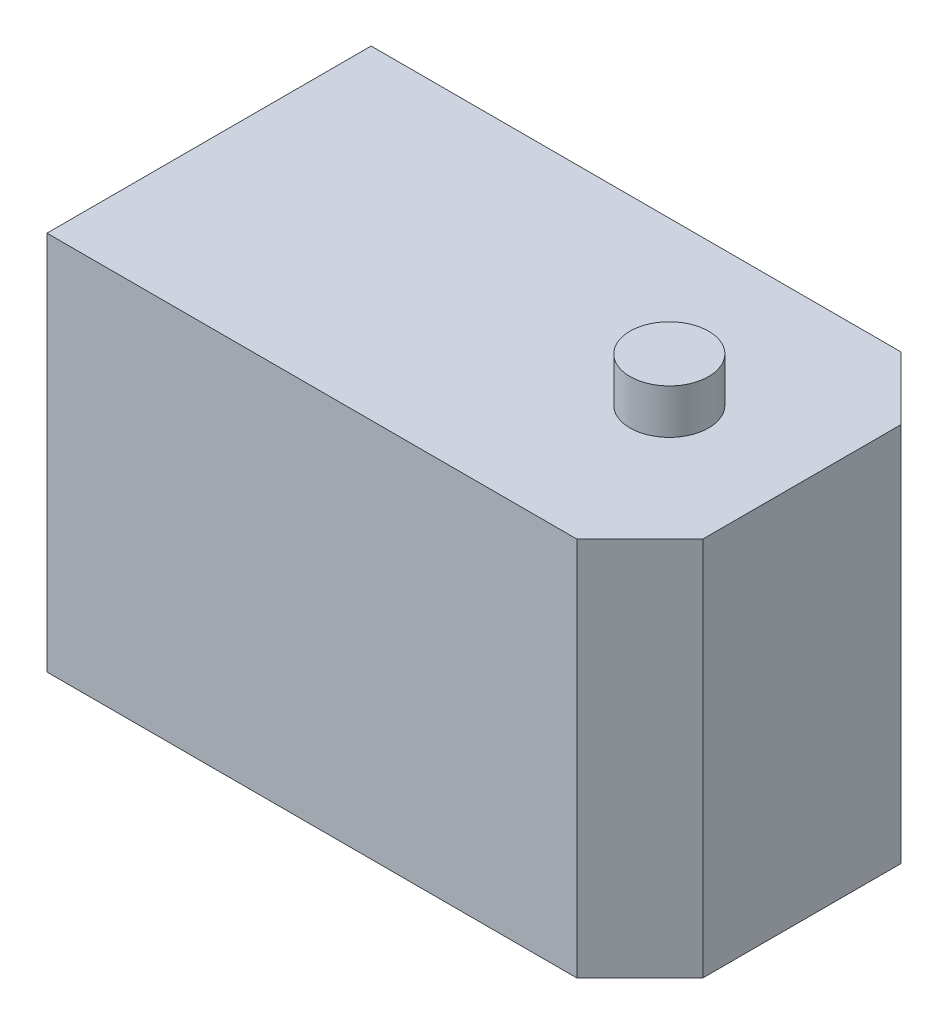
ISO-10303-21;
HEADER;
FILE_DESCRIPTION(('STEP AP214'),'2;1');
FILE_NAME('part.step','',(''),(''),'','','');
FILE_SCHEMA(('AUTOMOTIVE_DESIGN { 1 0 10303 214 1 1 1 1 }'));
ENDSEC;
DATA;
#1=APPLICATION_CONTEXT('core data for automotive mechanical design processes');
#2=APPLICATION_PROTOCOL_DEFINITION('international standard','automotive_design',2000,#1);
#3=PRODUCT_CONTEXT('',#1,'mechanical');
#4=PRODUCT('Part','Part','',(#3));
#5=PRODUCT_RELATED_PRODUCT_CATEGORY('part','',(#4));
#6=PRODUCT_DEFINITION_FORMATION('','',#4);
#7=PRODUCT_DEFINITION_CONTEXT('part definition',#1,'design');
#8=PRODUCT_DEFINITION('design','',#6,#7);
#9=PRODUCT_DEFINITION_SHAPE('','',#8);
#10=(LENGTH_UNIT() NAMED_UNIT(*) SI_UNIT(.MILLI.,.METRE.));
#11=(NAMED_UNIT(*) PLANE_ANGLE_UNIT() SI_UNIT($,.RADIAN.));
#12=(NAMED_UNIT(*) SI_UNIT($,.STERADIAN.) SOLID_ANGLE_UNIT());
#13=UNCERTAINTY_MEASURE_WITH_UNIT(LENGTH_MEASURE(1.E-05),#10,'distance_accuracy_value','');
#14=(GEOMETRIC_REPRESENTATION_CONTEXT(3) GLOBAL_UNCERTAINTY_ASSIGNED_CONTEXT((#13)) GLOBAL_UNIT_ASSIGNED_CONTEXT((#10,
#11,#12)) REPRESENTATION_CONTEXT('',''));
#15=CARTESIAN_POINT('',(0.,0.,0.));
#16=DIRECTION('',(0.,0.,1.));
#17=DIRECTION('',(1.,0.,0.));
#18=AXIS2_PLACEMENT_3D('',#15,#16,#17);
#19=CARTESIAN_POINT('',(10.115,29.,12.365));
#20=DIRECTION('',(-1.,0.,0.));
#21=DIRECTION('',(0.,0.,1.));
#22=AXIS2_PLACEMENT_3D('',#19,#20,#21);
#23=PLANE('',#22);
#24=DIRECTION('',(0.,0.,-1.));
#25=VECTOR('',#24,1.);
#26=CARTESIAN_POINT('',(10.115,0.,12.365));
#27=LINE('',#26,#25);
#28=CARTESIAN_POINT('',(10.115,0.,7.56266952966369));
#29=VERTEX_POINT('',#28);
#30=CARTESIAN_POINT('',(10.115,0.,-7.56266952966369));
#31=VERTEX_POINT('',#30);
#32=EDGE_CURVE('E97',#29,#31,#27,.T.);
#33=ORIENTED_EDGE('',*,*,#32,.T.);
#34=DIRECTION('',(0.,1.,0.));
#35=VECTOR('',#34,1.);
#36=CARTESIAN_POINT('',(10.115,-4.1,-7.56266952966369));
#37=LINE('',#36,#35);
#38=CARTESIAN_POINT('',(10.115,29.,-7.56266952966369));
#39=VERTEX_POINT('',#38);
#40=EDGE_CURVE('E55',#31,#39,#37,.T.);
#41=ORIENTED_EDGE('',*,*,#40,.T.);
#42=DIRECTION('',(0.,0.,-1.));
#43=VECTOR('',#42,1.);
#44=CARTESIAN_POINT('',(10.115,29.,12.365));
#45=LINE('',#44,#43);
#46=CARTESIAN_POINT('',(10.115,29.,7.56266952966369));
#47=VERTEX_POINT('',#46);
#48=EDGE_CURVE('E95',#47,#39,#45,.T.);
#49=ORIENTED_EDGE('',*,*,#48,.F.);
#50=DIRECTION('',(0.,1.,0.));
#51=VECTOR('',#50,1.);
#52=CARTESIAN_POINT('',(10.115,-4.1,7.56266952966369));
#53=LINE('',#52,#51);
#54=EDGE_CURVE('E89',#29,#47,#53,.T.);
#55=ORIENTED_EDGE('',*,*,#54,.F.);
#56=EDGE_LOOP('',(#33,#41,#49,#55));
#57=FACE_BOUND('',#56,.T.);
#58=ADVANCED_FACE('F33',(#57),#23,.F.);
#59=CARTESIAN_POINT('',(10.115,29.,-12.365));
#60=DIRECTION('',(0.,0.,1.));
#61=DIRECTION('',(1.,0.,0.));
#62=AXIS2_PLACEMENT_3D('',#59,#60,#61);
#63=PLANE('',#62);
#64=DIRECTION('',(-1.,0.,0.));
#65=VECTOR('',#64,1.);
#66=CARTESIAN_POINT('',(10.115,29.,-12.365));
#67=LINE('',#66,#65);
#68=CARTESIAN_POINT('',(5.31266952966369,29.,-12.365));
#69=VERTEX_POINT('',#68);
#70=CARTESIAN_POINT('',(-35.115,29.,-12.365));
#71=VERTEX_POINT('',#70);
#72=EDGE_CURVE('E104',#69,#71,#67,.T.);
#73=ORIENTED_EDGE('',*,*,#72,.F.);
#74=DIRECTION('',(0.,1.,0.));
#75=VECTOR('',#74,1.);
#76=CARTESIAN_POINT('',(5.31266952966369,-4.1,-12.365));
#77=LINE('',#76,#75);
#78=CARTESIAN_POINT('',(5.31266952966369,0.,-12.365));
#79=VERTEX_POINT('',#78);
#80=EDGE_CURVE('E85',#79,#69,#77,.T.);
#81=ORIENTED_EDGE('',*,*,#80,.F.);
#82=DIRECTION('',(-1.,0.,0.));
#83=VECTOR('',#82,1.);
#84=CARTESIAN_POINT('',(10.115,0.,-12.365));
#85=LINE('',#84,#83);
#86=CARTESIAN_POINT('',(-35.115,0.,-12.365));
#87=VERTEX_POINT('',#86);
#88=EDGE_CURVE('E121',#79,#87,#85,.T.);
#89=ORIENTED_EDGE('',*,*,#88,.T.);
#90=DIRECTION('',(0.,-1.,0.));
#91=VECTOR('',#90,1.);
#92=CARTESIAN_POINT('',(-35.115,29.,-12.365));
#93=LINE('',#92,#91);
#94=EDGE_CURVE('E127',#71,#87,#93,.T.);
#95=ORIENTED_EDGE('',*,*,#94,.F.);
#96=EDGE_LOOP('',(#73,#81,#89,#95));
#97=FACE_BOUND('',#96,.T.);
#98=ADVANCED_FACE('F146',(#97),#63,.F.);
#99=CARTESIAN_POINT('',(-35.115,29.,12.365));
#100=DIRECTION('',(1.,0.,0.));
#101=DIRECTION('',(0.,0.,-1.));
#102=AXIS2_PLACEMENT_3D('',#99,#100,#101);
#103=PLANE('',#102);
#104=DIRECTION('',(0.,0.,1.));
#105=VECTOR('',#104,1.);
#106=CARTESIAN_POINT('',(-35.115,0.,12.365));
#107=LINE('',#106,#105);
#108=CARTESIAN_POINT('',(-35.115,0.,12.365));
#109=VERTEX_POINT('',#108);
#110=EDGE_CURVE('E110',#87,#109,#107,.T.);
#111=ORIENTED_EDGE('',*,*,#110,.T.);
#112=DIRECTION('',(0.,-1.,0.));
#113=VECTOR('',#112,1.);
#114=CARTESIAN_POINT('',(-35.115,29.,12.365));
#115=LINE('',#114,#113);
#116=CARTESIAN_POINT('',(-35.115,29.,12.365));
#117=VERTEX_POINT('',#116);
#118=EDGE_CURVE('E119',#117,#109,#115,.T.);
#119=ORIENTED_EDGE('',*,*,#118,.F.);
#120=DIRECTION('',(0.,0.,1.));
#121=VECTOR('',#120,1.);
#122=CARTESIAN_POINT('',(-35.115,29.,12.365));
#123=LINE('',#122,#121);
#124=EDGE_CURVE('E107',#71,#117,#123,.T.);
#125=ORIENTED_EDGE('',*,*,#124,.F.);
#126=ORIENTED_EDGE('',*,*,#94,.T.);
#127=EDGE_LOOP('',(#111,#119,#125,#126));
#128=FACE_BOUND('',#127,.T.);
#129=ADVANCED_FACE('F143',(#128),#103,.F.);
#130=CARTESIAN_POINT('',(10.115,29.,12.365));
#131=DIRECTION('',(0.,0.,-1.));
#132=DIRECTION('',(-1.,0.,0.));
#133=AXIS2_PLACEMENT_3D('',#130,#131,#132);
#134=PLANE('',#133);
#135=DIRECTION('',(1.,0.,0.));
#136=VECTOR('',#135,1.);
#137=CARTESIAN_POINT('',(10.115,0.,12.365));
#138=LINE('',#137,#136);
#139=CARTESIAN_POINT('',(5.31266952966369,0.,12.365));
#140=VERTEX_POINT('',#139);
#141=EDGE_CURVE('E105',#109,#140,#138,.T.);
#142=ORIENTED_EDGE('',*,*,#141,.T.);
#143=DIRECTION('',(0.,1.,0.));
#144=VECTOR('',#143,1.);
#145=CARTESIAN_POINT('',(5.31266952966369,-4.1,12.365));
#146=LINE('',#145,#144);
#147=CARTESIAN_POINT('',(5.31266952966369,29.,12.365));
#148=VERTEX_POINT('',#147);
#149=EDGE_CURVE('E47',#140,#148,#146,.T.);
#150=ORIENTED_EDGE('',*,*,#149,.T.);
#151=DIRECTION('',(1.,0.,0.));
#152=VECTOR('',#151,1.);
#153=CARTESIAN_POINT('',(10.115,29.,12.365));
#154=LINE('',#153,#152);
#155=EDGE_CURVE('E117',#117,#148,#154,.T.);
#156=ORIENTED_EDGE('',*,*,#155,.F.);
#157=ORIENTED_EDGE('',*,*,#118,.T.);
#158=EDGE_LOOP('',(#142,#150,#156,#157));
#159=FACE_BOUND('',#158,.T.);
#160=ADVANCED_FACE('F138',(#159),#134,.F.);
#161=CARTESIAN_POINT('',(0.,29.,0.));
#162=DIRECTION('',(0.,1.,0.));
#163=DIRECTION('',(0.,0.,1.));
#164=AXIS2_PLACEMENT_3D('',#161,#162,#163);
#165=PLANE('',#164);
#166=DIRECTION('',(0.707106781186548,0.,0.707106781186548));
#167=VECTOR('',#166,1.);
#168=CARTESIAN_POINT('',(10.115,29.,-7.56266952966369));
#169=LINE('',#168,#167);
#170=EDGE_CURVE('E82',#69,#39,#169,.T.);
#171=ORIENTED_EDGE('',*,*,#170,.F.);
#172=ORIENTED_EDGE('',*,*,#72,.T.);
#173=ORIENTED_EDGE('',*,*,#124,.T.);
#174=ORIENTED_EDGE('',*,*,#155,.T.);
#175=DIRECTION('',(-0.707106781186547,0.,0.707106781186548));
#176=VECTOR('',#175,1.);
#177=CARTESIAN_POINT('',(10.115,29.,7.56266952966369));
#178=LINE('',#177,#176);
#179=EDGE_CURVE('E103',#47,#148,#178,.T.);
#180=ORIENTED_EDGE('',*,*,#179,.F.);
#181=ORIENTED_EDGE('',*,*,#48,.T.);
#182=EDGE_LOOP('',(#171,#172,#173,#174,#180,#181));
#183=FACE_BOUND('',#182,.T.);
#184=CARTESIAN_POINT('',(0.,29.,0.));
#185=DIRECTION('',(0.,1.,0.));
#186=DIRECTION('',(0.,0.,1.));
#187=AXIS2_PLACEMENT_3D('',#184,#185,#186);
#188=CIRCLE('',#187,3.);
#189=CARTESIAN_POINT('',(0.,29.,3.));
#190=VERTEX_POINT('',#189);
#191=EDGE_CURVE('E113',#190,#190,#188,.T.);
#192=ORIENTED_EDGE('',*,*,#191,.F.);
#193=EDGE_LOOP('',(#192));
#194=FACE_BOUND('',#193,.T.);
#195=ADVANCED_FACE('F100',(#183,#194),#165,.T.);
#196=CARTESIAN_POINT('',(0.,0.,0.));
#197=DIRECTION('',(0.,1.,0.));
#198=DIRECTION('',(0.,0.,1.));
#199=AXIS2_PLACEMENT_3D('',#196,#197,#198);
#200=PLANE('',#199);
#201=CARTESIAN_POINT('',(0.,0.,0.));
#202=DIRECTION('',(0.,1.,0.));
#203=DIRECTION('',(0.,0.,1.));
#204=AXIS2_PLACEMENT_3D('',#201,#202,#203);
#205=CIRCLE('',#204,3.);
#206=CARTESIAN_POINT('',(0.,0.,3.));
#207=VERTEX_POINT('',#206);
#208=EDGE_CURVE('E130',#207,#207,#205,.F.);
#209=ORIENTED_EDGE('',*,*,#208,.F.);
#210=EDGE_LOOP('',(#209));
#211=FACE_BOUND('',#210,.T.);
#212=ORIENTED_EDGE('',*,*,#88,.F.);
#213=DIRECTION('',(0.707106781186548,0.,0.707106781186548));
#214=VECTOR('',#213,1.);
#215=CARTESIAN_POINT('',(8.83883476483185,0.,-8.83883476483185));
#216=LINE('',#215,#214);
#217=EDGE_CURVE('E11',#79,#31,#216,.T.);
#218=ORIENTED_EDGE('',*,*,#217,.T.);
#219=ORIENTED_EDGE('',*,*,#32,.F.);
#220=DIRECTION('',(-0.707106781186547,0.,0.707106781186548));
#221=VECTOR('',#220,1.);
#222=CARTESIAN_POINT('',(8.83883476483185,0.,8.83883476483184));
#223=LINE('',#222,#221);
#224=EDGE_CURVE('E40',#29,#140,#223,.T.);
#225=ORIENTED_EDGE('',*,*,#224,.T.);
#226=ORIENTED_EDGE('',*,*,#141,.F.);
#227=ORIENTED_EDGE('',*,*,#110,.F.);
#228=EDGE_LOOP('',(#212,#218,#219,#225,#226,#227));
#229=FACE_BOUND('',#228,.T.);
#230=ADVANCED_FACE('F135',(#211,#229),#200,.F.);
#231=CARTESIAN_POINT('',(0.,32.4,0.));
#232=DIRECTION('',(0.,-1.,0.));
#233=DIRECTION('',(0.,0.,-1.));
#234=AXIS2_PLACEMENT_3D('',#231,#232,#233);
#235=CYLINDRICAL_SURFACE('',#234,3.);
#236=CARTESIAN_POINT('',(0.,32.4,0.));
#237=DIRECTION('',(0.,1.,0.));
#238=DIRECTION('',(0.,0.,1.));
#239=AXIS2_PLACEMENT_3D('',#236,#237,#238);
#240=CIRCLE('',#239,3.);
#241=CARTESIAN_POINT('',(0.,32.4,3.));
#242=VERTEX_POINT('',#241);
#243=EDGE_CURVE('E122',#242,#242,#240,.T.);
#244=ORIENTED_EDGE('',*,*,#243,.F.);
#245=EDGE_LOOP('',(#244));
#246=FACE_BOUND('',#245,.T.);
#247=ORIENTED_EDGE('',*,*,#191,.T.);
#248=EDGE_LOOP('',(#247));
#249=FACE_BOUND('',#248,.T.);
#250=ADVANCED_FACE('F160',(#246,#249),#235,.T.);
#251=CARTESIAN_POINT('',(0.,32.4,0.));
#252=DIRECTION('',(0.,1.,0.));
#253=DIRECTION('',(0.,0.,1.));
#254=AXIS2_PLACEMENT_3D('',#251,#252,#253);
#255=PLANE('',#254);
#256=ORIENTED_EDGE('',*,*,#243,.T.);
#257=EDGE_LOOP('',(#256));
#258=FACE_BOUND('',#257,.T.);
#259=ADVANCED_FACE('F230',(#258),#255,.T.);
#260=CARTESIAN_POINT('',(0.,-4.1,0.));
#261=DIRECTION('',(0.,1.,0.));
#262=DIRECTION('',(0.,0.,1.));
#263=AXIS2_PLACEMENT_3D('',#260,#261,#262);
#264=CYLINDRICAL_SURFACE('',#263,3.);
#265=CARTESIAN_POINT('',(0.,-4.1,0.));
#266=DIRECTION('',(0.,-1.,0.));
#267=DIRECTION('',(0.,0.,-1.));
#268=AXIS2_PLACEMENT_3D('',#265,#266,#267);
#269=CIRCLE('',#268,3.);
#270=CARTESIAN_POINT('',(0.,-4.1,-3.));
#271=VERTEX_POINT('',#270);
#272=EDGE_CURVE('E147',#271,#271,#269,.T.);
#273=ORIENTED_EDGE('',*,*,#272,.F.);
#274=EDGE_LOOP('',(#273));
#275=FACE_BOUND('',#274,.T.);
#276=ORIENTED_EDGE('',*,*,#208,.T.);
#277=EDGE_LOOP('',(#276));
#278=FACE_BOUND('',#277,.T.);
#279=ADVANCED_FACE('F226',(#275,#278),#264,.T.);
#280=CARTESIAN_POINT('',(0.,-4.1,0.));
#281=DIRECTION('',(0.,-1.,0.));
#282=DIRECTION('',(0.,0.,-1.));
#283=AXIS2_PLACEMENT_3D('',#280,#281,#282);
#284=PLANE('',#283);
#285=ORIENTED_EDGE('',*,*,#272,.T.);
#286=EDGE_LOOP('',(#285));
#287=FACE_BOUND('',#286,.T.);
#288=ADVANCED_FACE('F210',(#287),#284,.T.);
#289=CARTESIAN_POINT('',(10.115,-4.1,7.56266952966369));
#290=DIRECTION('',(-0.707106781186548,0.,-0.707106781186547));
#291=DIRECTION('',(-0.707106781186547,0.,0.707106781186548));
#292=AXIS2_PLACEMENT_3D('',#289,#290,#291);
#293=PLANE('',#292);
#294=ORIENTED_EDGE('',*,*,#54,.T.);
#295=ORIENTED_EDGE('',*,*,#179,.T.);
#296=ORIENTED_EDGE('',*,*,#149,.F.);
#297=ORIENTED_EDGE('',*,*,#224,.F.);
#298=EDGE_LOOP('',(#294,#295,#296,#297));
#299=FACE_BOUND('',#298,.T.);
#300=ADVANCED_FACE('F205',(#299),#293,.F.);
#301=CARTESIAN_POINT('',(10.115,-4.1,-7.56266952966369));
#302=DIRECTION('',(-0.707106781186547,0.,0.707106781186547));
#303=DIRECTION('',(0.707106781186548,0.,0.707106781186548));
#304=AXIS2_PLACEMENT_3D('',#301,#302,#303);
#305=PLANE('',#304);
#306=ORIENTED_EDGE('',*,*,#80,.T.);
#307=ORIENTED_EDGE('',*,*,#170,.T.);
#308=ORIENTED_EDGE('',*,*,#40,.F.);
#309=ORIENTED_EDGE('',*,*,#217,.F.);
#310=EDGE_LOOP('',(#306,#307,#308,#309));
#311=FACE_BOUND('',#310,.T.);
#312=ADVANCED_FACE('F83',(#311),#305,.F.);
#313=CLOSED_SHELL('',(#58,#98,#129,#160,#195,#230,#250,#259,#279,#288,#300,#312));
#314=MANIFOLD_SOLID_BREP('B2',#313);
#315=ADVANCED_BREP_SHAPE_REPRESENTATION('',(#18,#314),#14);
#316=SHAPE_DEFINITION_REPRESENTATION(#9,#315);
ENDSEC;
END-ISO-10303-21;
